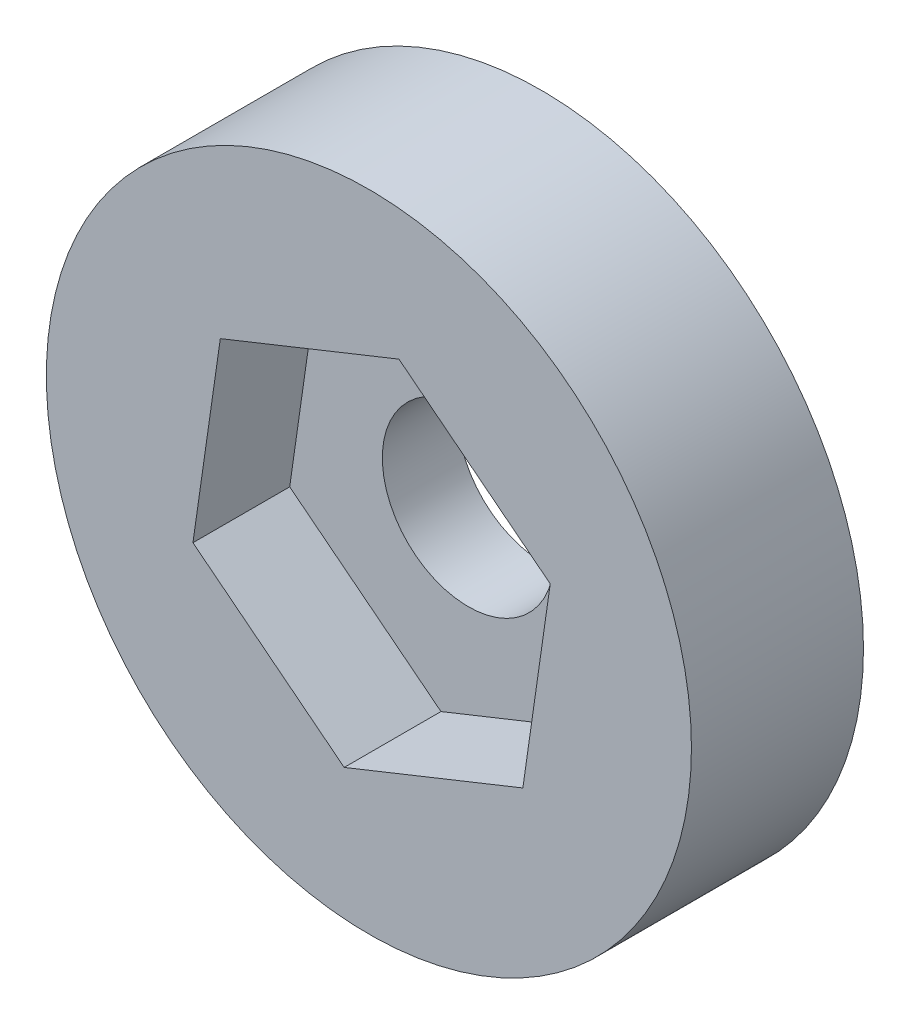
ISO-10303-21;
HEADER;
FILE_DESCRIPTION(('STEP AP214'),'2;1');
FILE_NAME('part.step','',(''),(''),'','','');
FILE_SCHEMA(('AUTOMOTIVE_DESIGN { 1 0 10303 214 1 1 1 1 }'));
ENDSEC;
DATA;
#1=APPLICATION_CONTEXT('core data for automotive mechanical design processes');
#2=APPLICATION_PROTOCOL_DEFINITION('international standard','automotive_design',2000,#1);
#3=PRODUCT_CONTEXT('',#1,'mechanical');
#4=PRODUCT('Part','Part','',(#3));
#5=PRODUCT_RELATED_PRODUCT_CATEGORY('part','',(#4));
#6=PRODUCT_DEFINITION_FORMATION('','',#4);
#7=PRODUCT_DEFINITION_CONTEXT('part definition',#1,'design');
#8=PRODUCT_DEFINITION('design','',#6,#7);
#9=PRODUCT_DEFINITION_SHAPE('','',#8);
#10=(LENGTH_UNIT() NAMED_UNIT(*) SI_UNIT(.MILLI.,.METRE.));
#11=(NAMED_UNIT(*) PLANE_ANGLE_UNIT() SI_UNIT($,.RADIAN.));
#12=(NAMED_UNIT(*) SI_UNIT($,.STERADIAN.) SOLID_ANGLE_UNIT());
#13=UNCERTAINTY_MEASURE_WITH_UNIT(LENGTH_MEASURE(1.E-05),#10,'distance_accuracy_value','');
#14=(GEOMETRIC_REPRESENTATION_CONTEXT(3) GLOBAL_UNCERTAINTY_ASSIGNED_CONTEXT((#13)) GLOBAL_UNIT_ASSIGNED_CONTEXT((#10,
#11,#12)) REPRESENTATION_CONTEXT('',''));
#15=CARTESIAN_POINT('',(0.,0.,0.));
#16=DIRECTION('',(0.,0.,1.));
#17=DIRECTION('',(1.,0.,0.));
#18=AXIS2_PLACEMENT_3D('',#15,#16,#17);
#19=CARTESIAN_POINT('',(58.8000000000001,0.,3.2));
#20=DIRECTION('',(0.,0.,-1.));
#21=DIRECTION('',(-1.,0.,0.));
#22=AXIS2_PLACEMENT_3D('',#19,#20,#21);
#23=CYLINDRICAL_SURFACE('',#22,6.);
#24=CARTESIAN_POINT('',(58.8000000000001,0.,3.2));
#25=DIRECTION('',(0.,0.,1.));
#26=DIRECTION('',(1.,0.,0.));
#27=AXIS2_PLACEMENT_3D('',#24,#25,#26);
#28=CIRCLE('',#27,6.);
#29=CARTESIAN_POINT('',(64.8000000000002,0.,3.2));
#30=VERTEX_POINT('',#29);
#31=EDGE_CURVE('E11',#30,#30,#28,.T.);
#32=ORIENTED_EDGE('',*,*,#31,.F.);
#33=EDGE_LOOP('',(#32));
#34=FACE_BOUND('',#33,.T.);
#35=CARTESIAN_POINT('',(58.8000000000001,0.,0.));
#36=DIRECTION('',(0.,0.,1.));
#37=DIRECTION('',(1.,0.,0.));
#38=AXIS2_PLACEMENT_3D('',#35,#36,#37);
#39=CIRCLE('',#38,6.);
#40=CARTESIAN_POINT('',(64.8000000000002,0.,0.));
#41=VERTEX_POINT('',#40);
#42=EDGE_CURVE('E40',#41,#41,#39,.T.);
#43=ORIENTED_EDGE('',*,*,#42,.T.);
#44=EDGE_LOOP('',(#43));
#45=FACE_BOUND('',#44,.T.);
#46=ADVANCED_FACE('F32',(#34,#45),#23,.T.);
#47=CARTESIAN_POINT('',(58.8000000000001,0.,3.2));
#48=DIRECTION('',(0.,0.,1.));
#49=DIRECTION('',(1.,0.,0.));
#50=AXIS2_PLACEMENT_3D('',#47,#48,#49);
#51=PLANE('',#50);
#52=DIRECTION('',(-0.786084540101207,0.618118998101396,0.));
#53=VECTOR('',#52,1.);
#54=CARTESIAN_POINT('',(62.1730918686975,1.33056144748406,3.2));
#55=LINE('',#54,#53);
#56=CARTESIAN_POINT('',(62.1730918686975,1.33056144748406,3.2));
#57=VERTEX_POINT('',#56);
#58=CARTESIAN_POINT('',(59.3592459195314,3.54316270114346,3.2));
#59=VERTEX_POINT('',#58);
#60=EDGE_CURVE('E48',#57,#59,#55,.T.);
#61=ORIENTED_EDGE('',*,*,#60,.F.);
#62=DIRECTION('',(0.14226448486699,0.989828680300551,0.));
#63=VECTOR('',#62,1.);
#64=CARTESIAN_POINT('',(61.6638459491662,-2.21260125365936,3.2));
#65=LINE('',#64,#63);
#66=CARTESIAN_POINT('',(61.6638459491662,-2.21260125365936,3.2));
#67=VERTEX_POINT('',#66);
#68=EDGE_CURVE('E131',#67,#57,#65,.T.);
#69=ORIENTED_EDGE('',*,*,#68,.F.);
#70=DIRECTION('',(0.928349024968198,0.371709682199153,0.));
#71=VECTOR('',#70,1.);
#72=CARTESIAN_POINT('',(58.3407540804688,-3.54316270114341,3.2));
#73=LINE('',#72,#71);
#74=CARTESIAN_POINT('',(58.3407540804688,-3.54316270114341,3.2));
#75=VERTEX_POINT('',#74);
#76=EDGE_CURVE('E129',#75,#67,#73,.T.);
#77=ORIENTED_EDGE('',*,*,#76,.F.);
#78=DIRECTION('',(0.786084540101207,-0.618118998101397,0.));
#79=VECTOR('',#78,1.);
#80=CARTESIAN_POINT('',(55.5269081313027,-1.33056144748402,3.2));
#81=LINE('',#80,#79);
#82=CARTESIAN_POINT('',(55.5269081313027,-1.33056144748402,3.2));
#83=VERTEX_POINT('',#82);
#84=EDGE_CURVE('E96',#83,#75,#81,.T.);
#85=ORIENTED_EDGE('',*,*,#84,.F.);
#86=DIRECTION('',(-0.142264484866993,-0.98982868030055,0.));
#87=VECTOR('',#86,1.);
#88=CARTESIAN_POINT('',(56.0361540508341,2.21260125365942,3.2));
#89=LINE('',#88,#87);
#90=CARTESIAN_POINT('',(56.0361540508341,2.21260125365942,3.2));
#91=VERTEX_POINT('',#90);
#92=EDGE_CURVE('E125',#91,#83,#89,.T.);
#93=ORIENTED_EDGE('',*,*,#92,.F.);
#94=DIRECTION('',(-0.928349024968198,-0.371709682199155,0.));
#95=VECTOR('',#94,1.);
#96=CARTESIAN_POINT('',(59.3592459195314,3.54316270114346,3.2));
#97=LINE('',#96,#95);
#98=EDGE_CURVE('E122',#59,#91,#97,.T.);
#99=ORIENTED_EDGE('',*,*,#98,.F.);
#100=EDGE_LOOP('',(#61,#69,#77,#85,#93,#99));
#101=FACE_BOUND('',#100,.T.);
#102=ORIENTED_EDGE('',*,*,#31,.T.);
#103=EDGE_LOOP('',(#102));
#104=FACE_BOUND('',#103,.T.);
#105=ADVANCED_FACE('F146',(#101,#104),#51,.T.);
#106=CARTESIAN_POINT('',(58.8000000000001,0.,0.));
#107=DIRECTION('',(0.,0.,1.));
#108=DIRECTION('',(1.,0.,0.));
#109=AXIS2_PLACEMENT_3D('',#106,#107,#108);
#110=PLANE('',#109);
#111=CARTESIAN_POINT('',(58.8500000000001,0.,0.));
#112=DIRECTION('',(0.,0.,1.));
#113=DIRECTION('',(1.,0.,0.));
#114=AXIS2_PLACEMENT_3D('',#111,#112,#113);
#115=CIRCLE('',#114,1.6);
#116=CARTESIAN_POINT('',(60.4500000000001,0.,0.));
#117=VERTEX_POINT('',#116);
#118=EDGE_CURVE('E35',#117,#117,#115,.T.);
#119=ORIENTED_EDGE('',*,*,#118,.T.);
#120=EDGE_LOOP('',(#119));
#121=FACE_BOUND('',#120,.T.);
#122=ORIENTED_EDGE('',*,*,#42,.F.);
#123=EDGE_LOOP('',(#122));
#124=FACE_BOUND('',#123,.T.);
#125=ADVANCED_FACE('F143',(#121,#124),#110,.F.);
#126=CARTESIAN_POINT('',(62.1730918686975,1.33056144748406,1.4));
#127=DIRECTION('',(0.618118998101396,0.786084540101207,0.));
#128=DIRECTION('',(-0.786084540101207,0.618118998101396,0.));
#129=AXIS2_PLACEMENT_3D('',#126,#127,#128);
#130=PLANE('',#129);
#131=ORIENTED_EDGE('',*,*,#60,.T.);
#132=DIRECTION('',(0.,0.,1.));
#133=VECTOR('',#132,1.);
#134=CARTESIAN_POINT('',(59.3592459195314,3.54316270114346,1.4));
#135=LINE('',#134,#133);
#136=CARTESIAN_POINT('',(59.3592459195314,3.54316270114346,1.4));
#137=VERTEX_POINT('',#136);
#138=EDGE_CURVE('E78',#137,#59,#135,.T.);
#139=ORIENTED_EDGE('',*,*,#138,.F.);
#140=DIRECTION('',(-0.786084540101207,0.618118998101396,0.));
#141=VECTOR('',#140,1.);
#142=CARTESIAN_POINT('',(62.1730918686975,1.33056144748406,1.4));
#143=LINE('',#142,#141);
#144=CARTESIAN_POINT('',(62.1730918686975,1.33056144748406,1.4));
#145=VERTEX_POINT('',#144);
#146=EDGE_CURVE('E133',#145,#137,#143,.T.);
#147=ORIENTED_EDGE('',*,*,#146,.F.);
#148=DIRECTION('',(0.,0.,1.));
#149=VECTOR('',#148,1.);
#150=CARTESIAN_POINT('',(62.1730918686975,1.33056144748406,1.4));
#151=LINE('',#150,#149);
#152=EDGE_CURVE('E56',#145,#57,#151,.T.);
#153=ORIENTED_EDGE('',*,*,#152,.T.);
#154=EDGE_LOOP('',(#131,#139,#147,#153));
#155=FACE_BOUND('',#154,.T.);
#156=ADVANCED_FACE('F145',(#155),#130,.F.);
#157=CARTESIAN_POINT('',(61.6638459491662,-2.21260125365936,1.4));
#158=DIRECTION('',(0.989828680300551,-0.14226448486699,0.));
#159=DIRECTION('',(0.14226448486699,0.989828680300551,0.));
#160=AXIS2_PLACEMENT_3D('',#157,#158,#159);
#161=PLANE('',#160);
#162=ORIENTED_EDGE('',*,*,#68,.T.);
#163=ORIENTED_EDGE('',*,*,#152,.F.);
#164=DIRECTION('',(0.14226448486699,0.989828680300551,0.));
#165=VECTOR('',#164,1.);
#166=CARTESIAN_POINT('',(61.6638459491662,-2.21260125365936,1.4));
#167=LINE('',#166,#165);
#168=CARTESIAN_POINT('',(61.6638459491662,-2.21260125365936,1.4));
#169=VERTEX_POINT('',#168);
#170=EDGE_CURVE('E108',#169,#145,#167,.T.);
#171=ORIENTED_EDGE('',*,*,#170,.F.);
#172=DIRECTION('',(0.,0.,1.));
#173=VECTOR('',#172,1.);
#174=CARTESIAN_POINT('',(61.6638459491662,-2.21260125365936,1.4));
#175=LINE('',#174,#173);
#176=EDGE_CURVE('E100',#169,#67,#175,.T.);
#177=ORIENTED_EDGE('',*,*,#176,.T.);
#178=EDGE_LOOP('',(#162,#163,#171,#177));
#179=FACE_BOUND('',#178,.T.);
#180=ADVANCED_FACE('F152',(#179),#161,.F.);
#181=CARTESIAN_POINT('',(58.3407540804688,-3.54316270114341,1.4));
#182=DIRECTION('',(0.371709682199153,-0.928349024968198,0.));
#183=DIRECTION('',(0.928349024968199,0.371709682199153,0.));
#184=AXIS2_PLACEMENT_3D('',#181,#182,#183);
#185=PLANE('',#184);
#186=ORIENTED_EDGE('',*,*,#76,.T.);
#187=ORIENTED_EDGE('',*,*,#176,.F.);
#188=DIRECTION('',(0.928349024968198,0.371709682199153,0.));
#189=VECTOR('',#188,1.);
#190=CARTESIAN_POINT('',(58.3407540804688,-3.54316270114341,1.4));
#191=LINE('',#190,#189);
#192=CARTESIAN_POINT('',(58.3407540804688,-3.54316270114341,1.4));
#193=VERTEX_POINT('',#192);
#194=EDGE_CURVE('E104',#193,#169,#191,.T.);
#195=ORIENTED_EDGE('',*,*,#194,.F.);
#196=DIRECTION('',(0.,0.,1.));
#197=VECTOR('',#196,1.);
#198=CARTESIAN_POINT('',(58.3407540804688,-3.54316270114341,1.4));
#199=LINE('',#198,#197);
#200=EDGE_CURVE('E89',#193,#75,#199,.T.);
#201=ORIENTED_EDGE('',*,*,#200,.T.);
#202=EDGE_LOOP('',(#186,#187,#195,#201));
#203=FACE_BOUND('',#202,.T.);
#204=ADVANCED_FACE('F105',(#203),#185,.F.);
#205=CARTESIAN_POINT('',(55.5269081313027,-1.33056144748402,1.4));
#206=DIRECTION('',(-0.618118998101397,-0.786084540101206,0.));
#207=DIRECTION('',(0.786084540101207,-0.618118998101397,0.));
#208=AXIS2_PLACEMENT_3D('',#205,#206,#207);
#209=PLANE('',#208);
#210=ORIENTED_EDGE('',*,*,#84,.T.);
#211=ORIENTED_EDGE('',*,*,#200,.F.);
#212=DIRECTION('',(0.786084540101207,-0.618118998101397,0.));
#213=VECTOR('',#212,1.);
#214=CARTESIAN_POINT('',(55.5269081313027,-1.33056144748402,1.4));
#215=LINE('',#214,#213);
#216=CARTESIAN_POINT('',(55.5269081313027,-1.33056144748402,1.4));
#217=VERTEX_POINT('',#216);
#218=EDGE_CURVE('E93',#217,#193,#215,.T.);
#219=ORIENTED_EDGE('',*,*,#218,.F.);
#220=DIRECTION('',(0.,0.,1.));
#221=VECTOR('',#220,1.);
#222=CARTESIAN_POINT('',(55.5269081313027,-1.33056144748402,1.4));
#223=LINE('',#222,#221);
#224=EDGE_CURVE('E101',#217,#83,#223,.T.);
#225=ORIENTED_EDGE('',*,*,#224,.T.);
#226=EDGE_LOOP('',(#210,#211,#219,#225));
#227=FACE_BOUND('',#226,.T.);
#228=ADVANCED_FACE('F91',(#227),#209,.F.);
#229=CARTESIAN_POINT('',(56.0361540508341,2.21260125365942,1.4));
#230=DIRECTION('',(-0.98982868030055,0.142264484866993,0.));
#231=DIRECTION('',(-0.142264484866993,-0.98982868030055,0.));
#232=AXIS2_PLACEMENT_3D('',#229,#230,#231);
#233=PLANE('',#232);
#234=ORIENTED_EDGE('',*,*,#92,.T.);
#235=ORIENTED_EDGE('',*,*,#224,.F.);
#236=DIRECTION('',(-0.142264484866993,-0.98982868030055,0.));
#237=VECTOR('',#236,1.);
#238=CARTESIAN_POINT('',(56.0361540508341,2.21260125365942,1.4));
#239=LINE('',#238,#237);
#240=CARTESIAN_POINT('',(56.0361540508341,2.21260125365942,1.4));
#241=VERTEX_POINT('',#240);
#242=EDGE_CURVE('E114',#241,#217,#239,.T.);
#243=ORIENTED_EDGE('',*,*,#242,.F.);
#244=DIRECTION('',(0.,0.,1.));
#245=VECTOR('',#244,1.);
#246=CARTESIAN_POINT('',(56.0361540508341,2.21260125365942,1.4));
#247=LINE('',#246,#245);
#248=EDGE_CURVE('E137',#241,#91,#247,.T.);
#249=ORIENTED_EDGE('',*,*,#248,.T.);
#250=EDGE_LOOP('',(#234,#235,#243,#249));
#251=FACE_BOUND('',#250,.T.);
#252=ADVANCED_FACE('F199',(#251),#233,.F.);
#253=CARTESIAN_POINT('',(59.3592459195314,3.54316270114346,1.4));
#254=DIRECTION('',(-0.371709682199155,0.928349024968198,0.));
#255=DIRECTION('',(-0.928349024968198,-0.371709682199155,0.));
#256=AXIS2_PLACEMENT_3D('',#253,#254,#255);
#257=PLANE('',#256);
#258=ORIENTED_EDGE('',*,*,#98,.T.);
#259=ORIENTED_EDGE('',*,*,#248,.F.);
#260=DIRECTION('',(-0.928349024968198,-0.371709682199155,0.));
#261=VECTOR('',#260,1.);
#262=CARTESIAN_POINT('',(59.3592459195314,3.54316270114346,1.4));
#263=LINE('',#262,#261);
#264=EDGE_CURVE('E116',#137,#241,#263,.T.);
#265=ORIENTED_EDGE('',*,*,#264,.F.);
#266=ORIENTED_EDGE('',*,*,#138,.T.);
#267=EDGE_LOOP('',(#258,#259,#265,#266));
#268=FACE_BOUND('',#267,.T.);
#269=ADVANCED_FACE('F208',(#268),#257,.F.);
#270=CARTESIAN_POINT('',(0.,0.,1.4));
#271=DIRECTION('',(0.,0.,1.));
#272=DIRECTION('',(1.,0.,0.));
#273=AXIS2_PLACEMENT_3D('',#270,#271,#272);
#274=PLANE('',#273);
#275=CARTESIAN_POINT('',(58.8500000000001,0.,1.4));
#276=DIRECTION('',(0.,0.,1.));
#277=DIRECTION('',(1.,0.,0.));
#278=AXIS2_PLACEMENT_3D('',#275,#276,#277);
#279=CIRCLE('',#278,1.6);
#280=CARTESIAN_POINT('',(60.4500000000001,0.,1.4));
#281=VERTEX_POINT('',#280);
#282=EDGE_CURVE('E247',#281,#281,#279,.T.);
#283=ORIENTED_EDGE('',*,*,#282,.F.);
#284=EDGE_LOOP('',(#283));
#285=FACE_BOUND('',#284,.T.);
#286=ORIENTED_EDGE('',*,*,#146,.T.);
#287=ORIENTED_EDGE('',*,*,#264,.T.);
#288=ORIENTED_EDGE('',*,*,#242,.T.);
#289=ORIENTED_EDGE('',*,*,#218,.T.);
#290=ORIENTED_EDGE('',*,*,#194,.T.);
#291=ORIENTED_EDGE('',*,*,#170,.T.);
#292=EDGE_LOOP('',(#286,#287,#288,#289,#290,#291));
#293=FACE_BOUND('',#292,.T.);
#294=ADVANCED_FACE('F111',(#285,#293),#274,.T.);
#295=CARTESIAN_POINT('',(58.8500000000001,0.,-2.4));
#296=DIRECTION('',(0.,0.,1.));
#297=DIRECTION('',(1.,0.,0.));
#298=AXIS2_PLACEMENT_3D('',#295,#296,#297);
#299=CYLINDRICAL_SURFACE('',#298,1.6);
#300=CARTESIAN_POINT('',(60.4500000000001,0.,1.4));
#301=CARTESIAN_POINT('',(60.4500000000001,0.,1.38541666666667));
#302=CARTESIAN_POINT('',(60.4500000000001,0.,1.37083333333333));
#303=CARTESIAN_POINT('',(60.4500000000001,0.,1.34166666666667));
#304=CARTESIAN_POINT('',(60.4500000000001,0.,1.32708333333333));
#305=CARTESIAN_POINT('',(60.4500000000001,0.,1.29791666666667));
#306=CARTESIAN_POINT('',(60.4500000000001,0.,1.28333333333333));
#307=CARTESIAN_POINT('',(60.4500000000001,0.,1.25416666666667));
#308=CARTESIAN_POINT('',(60.4500000000001,0.,1.23958333333333));
#309=CARTESIAN_POINT('',(60.4500000000001,0.,1.21041666666667));
#310=CARTESIAN_POINT('',(60.4500000000001,0.,1.19583333333333));
#311=CARTESIAN_POINT('',(60.4500000000001,0.,1.16666666666667));
#312=CARTESIAN_POINT('',(60.4500000000001,0.,1.15208333333333));
#313=CARTESIAN_POINT('',(60.4500000000001,0.,1.12291666666667));
#314=CARTESIAN_POINT('',(60.4500000000001,0.,1.10833333333333));
#315=CARTESIAN_POINT('',(60.4500000000001,0.,1.07916666666667));
#316=CARTESIAN_POINT('',(60.4500000000001,0.,1.06458333333333));
#317=CARTESIAN_POINT('',(60.4500000000001,0.,1.03541666666667));
#318=CARTESIAN_POINT('',(60.4500000000001,0.,1.02083333333333));
#319=CARTESIAN_POINT('',(60.4500000000001,0.,0.991666666666667));
#320=CARTESIAN_POINT('',(60.4500000000001,0.,0.977083333333334));
#321=CARTESIAN_POINT('',(60.4500000000001,0.,0.947916666666667));
#322=CARTESIAN_POINT('',(60.4500000000001,0.,0.933333333333334));
#323=CARTESIAN_POINT('',(60.4500000000001,0.,0.904166666666667));
#324=CARTESIAN_POINT('',(60.4500000000001,0.,0.889583333333333));
#325=CARTESIAN_POINT('',(60.4500000000001,0.,0.860416666666667));
#326=CARTESIAN_POINT('',(60.4500000000001,0.,0.845833333333334));
#327=CARTESIAN_POINT('',(60.4500000000001,0.,0.816666666666667));
#328=CARTESIAN_POINT('',(60.4500000000001,0.,0.802083333333333));
#329=CARTESIAN_POINT('',(60.4500000000001,0.,0.772916666666667));
#330=CARTESIAN_POINT('',(60.4500000000001,0.,0.758333333333333));
#331=CARTESIAN_POINT('',(60.4500000000001,0.,0.729166666666667));
#332=CARTESIAN_POINT('',(60.4500000000001,0.,0.714583333333333));
#333=CARTESIAN_POINT('',(60.4500000000001,0.,0.685416666666667));
#334=CARTESIAN_POINT('',(60.4500000000001,0.,0.670833333333334));
#335=CARTESIAN_POINT('',(60.4500000000001,0.,0.641666666666667));
#336=CARTESIAN_POINT('',(60.4500000000001,0.,0.627083333333334));
#337=CARTESIAN_POINT('',(60.4500000000001,0.,0.597916666666667));
#338=CARTESIAN_POINT('',(60.4500000000001,0.,0.583333333333333));
#339=CARTESIAN_POINT('',(60.4500000000001,0.,0.554166666666667));
#340=CARTESIAN_POINT('',(60.4500000000001,0.,0.539583333333333));
#341=CARTESIAN_POINT('',(60.4500000000001,0.,0.510416666666667));
#342=CARTESIAN_POINT('',(60.4500000000001,0.,0.495833333333333));
#343=CARTESIAN_POINT('',(60.4500000000001,0.,0.466666666666667));
#344=CARTESIAN_POINT('',(60.4500000000001,0.,0.452083333333333));
#345=CARTESIAN_POINT('',(60.4500000000001,0.,0.422916666666667));
#346=CARTESIAN_POINT('',(60.4500000000001,0.,0.408333333333333));
#347=CARTESIAN_POINT('',(60.4500000000001,0.,0.379166666666667));
#348=CARTESIAN_POINT('',(60.4500000000001,0.,0.364583333333333));
#349=CARTESIAN_POINT('',(60.4500000000001,0.,0.335416666666667));
#350=CARTESIAN_POINT('',(60.4500000000001,0.,0.320833333333333));
#351=CARTESIAN_POINT('',(60.4500000000001,0.,0.291666666666667));
#352=CARTESIAN_POINT('',(60.4500000000001,0.,0.277083333333333));
#353=CARTESIAN_POINT('',(60.4500000000001,0.,0.247916666666667));
#354=CARTESIAN_POINT('',(60.4500000000001,0.,0.233333333333334));
#355=CARTESIAN_POINT('',(60.4500000000001,0.,0.204166666666667));
#356=CARTESIAN_POINT('',(60.4500000000001,0.,0.189583333333333));
#357=CARTESIAN_POINT('',(60.4500000000001,0.,0.160416666666667));
#358=CARTESIAN_POINT('',(60.4500000000001,0.,0.145833333333333));
#359=CARTESIAN_POINT('',(60.4500000000001,0.,0.116666666666667));
#360=CARTESIAN_POINT('',(60.4500000000001,0.,0.102083333333333));
#361=CARTESIAN_POINT('',(60.4500000000001,0.,0.0729166666666666));
#362=CARTESIAN_POINT('',(60.4500000000001,0.,0.0583333333333333));
#363=CARTESIAN_POINT('',(60.4500000000001,0.,0.0291666666666666));
#364=CARTESIAN_POINT('',(60.4500000000001,0.,0.0145833333333333));
#365=CARTESIAN_POINT('',(60.4500000000001,0.,0.));
#366=B_SPLINE_CURVE_WITH_KNOTS('',3,(#300,#301,#302,#303,#304,#305,#306,#307,#308,#309,#310,
#311,#312,#313,#314,#315,#316,#317,#318,#319,#320,#321,#322,#323,#324,#325,#326,#327,#328,#329,
#330,#331,#332,#333,#334,#335,#336,#337,#338,#339,#340,#341,#342,#343,#344,#345,#346,#347,#348,
#349,#350,#351,#352,#353,#354,#355,#356,#357,#358,#359,#360,#361,#362,#363,#364,#365),
.UNSPECIFIED.,.F.,.F.,(4,2,2,2,2,2,2,2,2,2,2,2,2,2,2,2,2,2,2,2,2,2,2,2,2,2,2,2,2,2,2,2,4),(0.,
0.04375,0.0874999999999999,0.13125,0.175,0.21875,0.2625,0.30625,0.35,0.39375,0.4375,0.48125,
0.525,0.56875,0.6125,0.65625,0.7,0.74375,0.7875,0.83125,0.875,0.91875,0.9625,1.00625,1.05,
1.09375,1.1375,1.18125,1.225,1.26875,1.3125,1.35625,1.4),.UNSPECIFIED.);
#367=EDGE_CURVE('BSEAM230',#281,#117,#366,.T.);
#368=ORIENTED_EDGE('',*,*,#282,.T.);
#369=ORIENTED_EDGE('',*,*,#118,.F.);
#370=ORIENTED_EDGE('',*,*,#367,.T.);
#371=ORIENTED_EDGE('',*,*,#367,.F.);
#372=EDGE_LOOP('',(#368,#370,#369,#371));
#373=FACE_BOUND('',#372,.T.);
#374=ADVANCED_FACE('F230',(#373),#299,.F.);
#375=CLOSED_SHELL('',(#46,#105,#125,#156,#180,#204,#228,#252,#269,#294,#374));
#376=MANIFOLD_SOLID_BREP('B2',#375);
#377=ADVANCED_BREP_SHAPE_REPRESENTATION('',(#18,#376),#14);
#378=SHAPE_DEFINITION_REPRESENTATION(#9,#377);
ENDSEC;
END-ISO-10303-21;
